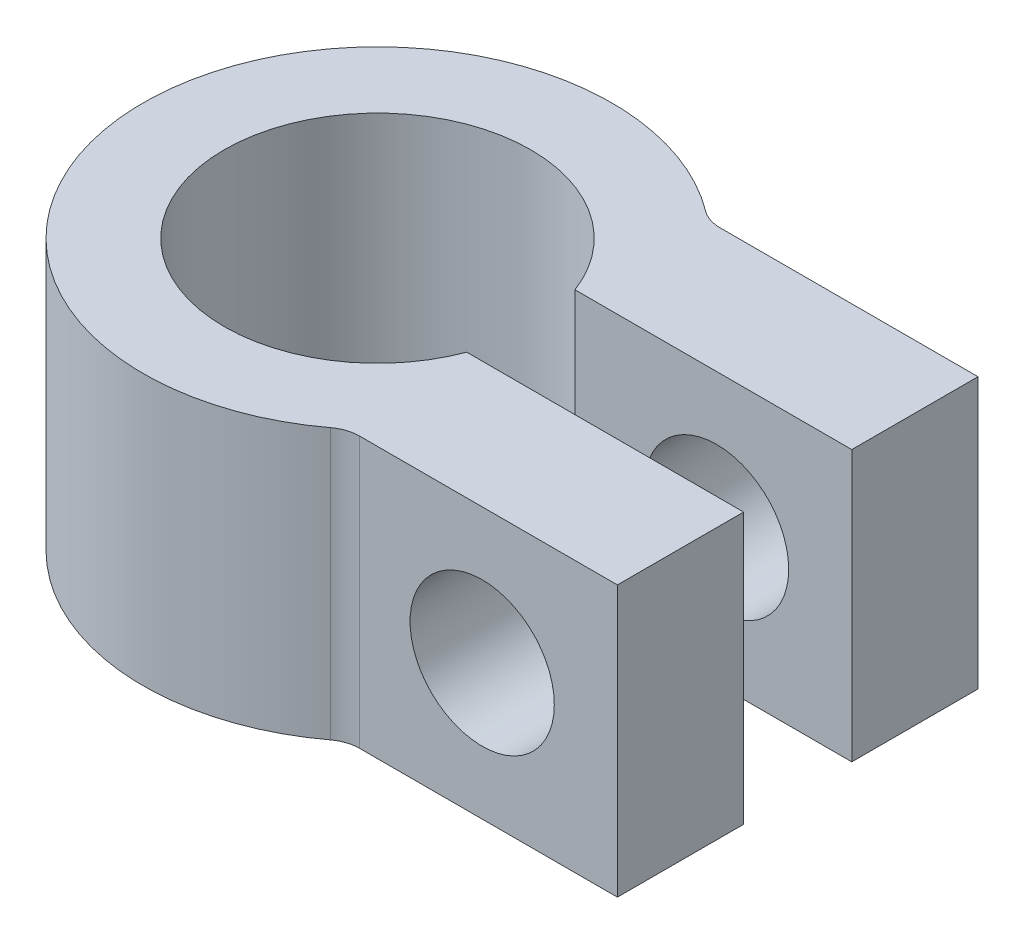
ISO-10303-21;
HEADER;
FILE_DESCRIPTION(('STEP AP214'),'2;1');
FILE_NAME('part.step','',(''),(''),'','','');
FILE_SCHEMA(('AUTOMOTIVE_DESIGN { 1 0 10303 214 1 1 1 1 }'));
ENDSEC;
DATA;
#1=APPLICATION_CONTEXT('core data for automotive mechanical design processes');
#2=APPLICATION_PROTOCOL_DEFINITION('international standard','automotive_design',2000,#1);
#3=PRODUCT_CONTEXT('',#1,'mechanical');
#4=PRODUCT('Part','Part','',(#3));
#5=PRODUCT_RELATED_PRODUCT_CATEGORY('part','',(#4));
#6=PRODUCT_DEFINITION_FORMATION('','',#4);
#7=PRODUCT_DEFINITION_CONTEXT('part definition',#1,'design');
#8=PRODUCT_DEFINITION('design','',#6,#7);
#9=PRODUCT_DEFINITION_SHAPE('','',#8);
#10=(LENGTH_UNIT() NAMED_UNIT(*) SI_UNIT(.MILLI.,.METRE.));
#11=(NAMED_UNIT(*) PLANE_ANGLE_UNIT() SI_UNIT($,.RADIAN.));
#12=(NAMED_UNIT(*) SI_UNIT($,.STERADIAN.) SOLID_ANGLE_UNIT());
#13=UNCERTAINTY_MEASURE_WITH_UNIT(LENGTH_MEASURE(1.E-05),#10,'distance_accuracy_value','');
#14=(GEOMETRIC_REPRESENTATION_CONTEXT(3) GLOBAL_UNCERTAINTY_ASSIGNED_CONTEXT((#13)) GLOBAL_UNIT_ASSIGNED_CONTEXT((#10,
#11,#12)) REPRESENTATION_CONTEXT('',''));
#15=CARTESIAN_POINT('',(0.,0.,0.));
#16=DIRECTION('',(0.,0.,1.));
#17=DIRECTION('',(1.,0.,0.));
#18=AXIS2_PLACEMENT_3D('',#15,#16,#17);
#19=CARTESIAN_POINT('',(0.,15.,0.));
#20=DIRECTION('',(0.,-1.,0.));
#21=DIRECTION('',(0.,0.,-1.));
#22=AXIS2_PLACEMENT_3D('',#19,#20,#21);
#23=CYLINDRICAL_SURFACE('',#22,13.);
#24=CARTESIAN_POINT('',(0.,15.,0.));
#25=DIRECTION('',(0.,1.,0.));
#26=DIRECTION('',(0.,0.,1.));
#27=AXIS2_PLACEMENT_3D('',#24,#25,#26);
#28=CIRCLE('',#27,13.);
#29=CARTESIAN_POINT('',(7.8,15.,-10.4));
#30=VERTEX_POINT('',#29);
#31=CARTESIAN_POINT('',(7.8,15.,10.4));
#32=VERTEX_POINT('',#31);
#33=EDGE_CURVE('E138',#30,#32,#28,.T.);
#34=ORIENTED_EDGE('',*,*,#33,.F.);
#35=DIRECTION('',(0.,-1.,0.));
#36=VECTOR('',#35,1.);
#37=CARTESIAN_POINT('',(7.8,15.,-10.4));
#38=LINE('',#37,#36);
#39=CARTESIAN_POINT('',(7.8,0.,-10.4));
#40=VERTEX_POINT('',#39);
#41=EDGE_CURVE('E163',#30,#40,#38,.T.);
#42=ORIENTED_EDGE('',*,*,#41,.T.);
#43=CARTESIAN_POINT('',(0.,0.,0.));
#44=DIRECTION('',(0.,1.,0.));
#45=DIRECTION('',(0.,0.,1.));
#46=AXIS2_PLACEMENT_3D('',#43,#44,#45);
#47=CIRCLE('',#46,13.);
#48=CARTESIAN_POINT('',(7.8,0.,10.4));
#49=VERTEX_POINT('',#48);
#50=EDGE_CURVE('E135',#40,#49,#47,.T.);
#51=ORIENTED_EDGE('',*,*,#50,.T.);
#52=DIRECTION('',(0.,-1.,0.));
#53=VECTOR('',#52,1.);
#54=CARTESIAN_POINT('',(7.8,15.,10.4));
#55=LINE('',#54,#53);
#56=EDGE_CURVE('E155',#49,#32,#55,.F.);
#57=ORIENTED_EDGE('',*,*,#56,.T.);
#58=EDGE_LOOP('',(#34,#42,#51,#57));
#59=FACE_BOUND('',#58,.T.);
#60=ADVANCED_FACE('F32',(#59),#23,.T.);
#61=CARTESIAN_POINT('',(0.,15.,0.));
#62=DIRECTION('',(0.,1.,0.));
#63=DIRECTION('',(0.,0.,1.));
#64=AXIS2_PLACEMENT_3D('',#61,#62,#63);
#65=PLANE('',#64);
#66=CARTESIAN_POINT('',(0.,15.,0.));
#67=DIRECTION('',(0.,1.,0.));
#68=DIRECTION('',(0.,0.,1.));
#69=AXIS2_PLACEMENT_3D('',#66,#67,#68);
#70=CIRCLE('',#69,8.5);
#71=CARTESIAN_POINT('',(7.95298686029343,15.,-3.));
#72=VERTEX_POINT('',#71);
#73=CARTESIAN_POINT('',(7.95298686029343,15.,3.));
#74=VERTEX_POINT('',#73);
#75=EDGE_CURVE('E113',#72,#74,#70,.T.);
#76=ORIENTED_EDGE('',*,*,#75,.F.);
#77=DIRECTION('',(1.,0.,0.));
#78=VECTOR('',#77,1.);
#79=CARTESIAN_POINT('',(23.3066238629181,15.,-3.));
#80=LINE('',#79,#78);
#81=CARTESIAN_POINT('',(23.3066238629181,15.,-3.));
#82=VERTEX_POINT('',#81);
#83=EDGE_CURVE('E197',#72,#82,#80,.T.);
#84=ORIENTED_EDGE('',*,*,#83,.T.);
#85=DIRECTION('',(0.,0.,-1.));
#86=VECTOR('',#85,1.);
#87=CARTESIAN_POINT('',(23.3066238629181,15.,-3.));
#88=LINE('',#87,#86);
#89=CARTESIAN_POINT('',(23.3066238629181,15.,-10.));
#90=VERTEX_POINT('',#89);
#91=EDGE_CURVE('E205',#82,#90,#88,.T.);
#92=ORIENTED_EDGE('',*,*,#91,.T.);
#93=DIRECTION('',(-1.,0.,0.));
#94=VECTOR('',#93,1.);
#95=CARTESIAN_POINT('',(8.30662386291808,15.,-10.));
#96=LINE('',#95,#94);
#97=CARTESIAN_POINT('',(9.,15.,-10.));
#98=VERTEX_POINT('',#97);
#99=EDGE_CURVE('E140',#90,#98,#96,.T.);
#100=ORIENTED_EDGE('',*,*,#99,.T.);
#101=CARTESIAN_POINT('',(9.,15.,-12.));
#102=DIRECTION('',(0.,1.,0.));
#103=DIRECTION('',(0.,0.,1.));
#104=AXIS2_PLACEMENT_3D('',#101,#102,#103);
#105=CIRCLE('',#104,2.);
#106=EDGE_CURVE('E11',#98,#30,#105,.F.);
#107=ORIENTED_EDGE('',*,*,#106,.T.);
#108=ORIENTED_EDGE('',*,*,#33,.T.);
#109=CARTESIAN_POINT('',(9.,15.,12.));
#110=DIRECTION('',(0.,1.,0.));
#111=DIRECTION('',(0.,0.,1.));
#112=AXIS2_PLACEMENT_3D('',#109,#110,#111);
#113=CIRCLE('',#112,2.);
#114=CARTESIAN_POINT('',(9.,15.,10.));
#115=VERTEX_POINT('',#114);
#116=EDGE_CURVE('E161',#32,#115,#113,.F.);
#117=ORIENTED_EDGE('',*,*,#116,.T.);
#118=DIRECTION('',(-1.,0.,0.));
#119=VECTOR('',#118,1.);
#120=CARTESIAN_POINT('',(8.30662386291808,15.,10.));
#121=LINE('',#120,#119);
#122=CARTESIAN_POINT('',(23.3066238629181,15.,10.));
#123=VERTEX_POINT('',#122);
#124=EDGE_CURVE('E119',#123,#115,#121,.T.);
#125=ORIENTED_EDGE('',*,*,#124,.F.);
#126=DIRECTION('',(0.,0.,1.));
#127=VECTOR('',#126,1.);
#128=CARTESIAN_POINT('',(23.3066238629181,15.,3.));
#129=LINE('',#128,#127);
#130=CARTESIAN_POINT('',(23.3066238629181,15.,3.));
#131=VERTEX_POINT('',#130);
#132=EDGE_CURVE('E115',#131,#123,#129,.T.);
#133=ORIENTED_EDGE('',*,*,#132,.F.);
#134=DIRECTION('',(1.,0.,0.));
#135=VECTOR('',#134,1.);
#136=CARTESIAN_POINT('',(23.3066238629181,15.,3.));
#137=LINE('',#136,#135);
#138=EDGE_CURVE('E108',#74,#131,#137,.T.);
#139=ORIENTED_EDGE('',*,*,#138,.F.);
#140=EDGE_LOOP('',(#76,#84,#92,#100,#107,#108,#117,#125,#133,#139));
#141=FACE_BOUND('',#140,.T.);
#142=ADVANCED_FACE('F110',(#141),#65,.T.);
#143=CARTESIAN_POINT('',(0.,0.,0.));
#144=DIRECTION('',(0.,1.,0.));
#145=DIRECTION('',(0.,0.,1.));
#146=AXIS2_PLACEMENT_3D('',#143,#144,#145);
#147=PLANE('',#146);
#148=DIRECTION('',(1.,0.,0.));
#149=VECTOR('',#148,1.);
#150=CARTESIAN_POINT('',(23.3066238629181,0.,-3.));
#151=LINE('',#150,#149);
#152=CARTESIAN_POINT('',(7.95298686029343,0.,-3.));
#153=VERTEX_POINT('',#152);
#154=CARTESIAN_POINT('',(23.3066238629181,0.,-3.));
#155=VERTEX_POINT('',#154);
#156=EDGE_CURVE('E194',#153,#155,#151,.T.);
#157=ORIENTED_EDGE('',*,*,#156,.F.);
#158=CARTESIAN_POINT('',(0.,0.,0.));
#159=DIRECTION('',(0.,1.,0.));
#160=DIRECTION('',(0.,0.,1.));
#161=AXIS2_PLACEMENT_3D('',#158,#159,#160);
#162=CIRCLE('',#161,8.5);
#163=CARTESIAN_POINT('',(7.95298686029343,0.,3.));
#164=VERTEX_POINT('',#163);
#165=EDGE_CURVE('E136',#153,#164,#162,.T.);
#166=ORIENTED_EDGE('',*,*,#165,.T.);
#167=DIRECTION('',(1.,0.,0.));
#168=VECTOR('',#167,1.);
#169=CARTESIAN_POINT('',(23.3066238629181,0.,3.));
#170=LINE('',#169,#168);
#171=CARTESIAN_POINT('',(23.3066238629181,0.,3.));
#172=VERTEX_POINT('',#171);
#173=EDGE_CURVE('E125',#164,#172,#170,.T.);
#174=ORIENTED_EDGE('',*,*,#173,.T.);
#175=DIRECTION('',(0.,0.,1.));
#176=VECTOR('',#175,1.);
#177=CARTESIAN_POINT('',(23.3066238629181,0.,3.));
#178=LINE('',#177,#176);
#179=CARTESIAN_POINT('',(23.3066238629181,0.,10.));
#180=VERTEX_POINT('',#179);
#181=EDGE_CURVE('E190',#172,#180,#178,.T.);
#182=ORIENTED_EDGE('',*,*,#181,.T.);
#183=DIRECTION('',(-1.,0.,0.));
#184=VECTOR('',#183,1.);
#185=CARTESIAN_POINT('',(8.30662386291808,0.,10.));
#186=LINE('',#185,#184);
#187=CARTESIAN_POINT('',(9.,0.,10.));
#188=VERTEX_POINT('',#187);
#189=EDGE_CURVE('E176',#180,#188,#186,.T.);
#190=ORIENTED_EDGE('',*,*,#189,.T.);
#191=CARTESIAN_POINT('',(9.,0.,12.));
#192=DIRECTION('',(0.,1.,0.));
#193=DIRECTION('',(0.,0.,1.));
#194=AXIS2_PLACEMENT_3D('',#191,#192,#193);
#195=CIRCLE('',#194,2.);
#196=EDGE_CURVE('E158',#188,#49,#195,.T.);
#197=ORIENTED_EDGE('',*,*,#196,.T.);
#198=ORIENTED_EDGE('',*,*,#50,.F.);
#199=CARTESIAN_POINT('',(9.,0.,-12.));
#200=DIRECTION('',(0.,1.,0.));
#201=DIRECTION('',(0.,0.,1.));
#202=AXIS2_PLACEMENT_3D('',#199,#200,#201);
#203=CIRCLE('',#202,2.);
#204=CARTESIAN_POINT('',(9.,0.,-10.));
#205=VERTEX_POINT('',#204);
#206=EDGE_CURVE('E40',#40,#205,#203,.T.);
#207=ORIENTED_EDGE('',*,*,#206,.T.);
#208=DIRECTION('',(-1.,0.,0.));
#209=VECTOR('',#208,1.);
#210=CARTESIAN_POINT('',(8.30662386291808,0.,-10.));
#211=LINE('',#210,#209);
#212=CARTESIAN_POINT('',(23.3066238629181,0.,-10.));
#213=VERTEX_POINT('',#212);
#214=EDGE_CURVE('E198',#213,#205,#211,.T.);
#215=ORIENTED_EDGE('',*,*,#214,.F.);
#216=DIRECTION('',(0.,0.,-1.));
#217=VECTOR('',#216,1.);
#218=CARTESIAN_POINT('',(23.3066238629181,0.,-3.));
#219=LINE('',#218,#217);
#220=EDGE_CURVE('E201',#155,#213,#219,.T.);
#221=ORIENTED_EDGE('',*,*,#220,.F.);
#222=EDGE_LOOP('',(#157,#166,#174,#182,#190,#197,#198,#207,#215,#221));
#223=FACE_BOUND('',#222,.T.);
#224=ADVANCED_FACE('F171',(#223),#147,.F.);
#225=CARTESIAN_POINT('',(0.,15.,0.));
#226=DIRECTION('',(0.,-1.,0.));
#227=DIRECTION('',(0.,0.,-1.));
#228=AXIS2_PLACEMENT_3D('',#225,#226,#227);
#229=CYLINDRICAL_SURFACE('',#228,8.5);
#230=DIRECTION('',(0.,-1.,0.));
#231=VECTOR('',#230,1.);
#232=CARTESIAN_POINT('',(7.95298686029343,15.,-3.));
#233=LINE('',#232,#231);
#234=EDGE_CURVE('E129',#72,#153,#233,.T.);
#235=ORIENTED_EDGE('',*,*,#234,.F.);
#236=ORIENTED_EDGE('',*,*,#75,.T.);
#237=DIRECTION('',(0.,-1.,0.));
#238=VECTOR('',#237,1.);
#239=CARTESIAN_POINT('',(7.95298686029343,15.,3.));
#240=LINE('',#239,#238);
#241=EDGE_CURVE('E122',#164,#74,#240,.F.);
#242=ORIENTED_EDGE('',*,*,#241,.F.);
#243=ORIENTED_EDGE('',*,*,#165,.F.);
#244=EDGE_LOOP('',(#235,#236,#242,#243));
#245=FACE_BOUND('',#244,.T.);
#246=ADVANCED_FACE('F133',(#245),#229,.F.);
#247=CARTESIAN_POINT('',(23.3066238629181,31.5529453572468,-3.));
#248=DIRECTION('',(-1.,0.,0.));
#249=DIRECTION('',(0.,0.,1.));
#250=AXIS2_PLACEMENT_3D('',#247,#248,#249);
#251=PLANE('',#250);
#252=ORIENTED_EDGE('',*,*,#91,.F.);
#253=DIRECTION('',(0.,-1.,0.));
#254=VECTOR('',#253,1.);
#255=CARTESIAN_POINT('',(23.3066238629181,31.5529453572468,-3.));
#256=LINE('',#255,#254);
#257=EDGE_CURVE('E143',#82,#155,#256,.T.);
#258=ORIENTED_EDGE('',*,*,#257,.T.);
#259=ORIENTED_EDGE('',*,*,#220,.T.);
#260=DIRECTION('',(0.,-1.,0.));
#261=VECTOR('',#260,1.);
#262=CARTESIAN_POINT('',(23.3066238629181,31.5529453572468,-10.));
#263=LINE('',#262,#261);
#264=EDGE_CURVE('E200',#90,#213,#263,.T.);
#265=ORIENTED_EDGE('',*,*,#264,.F.);
#266=EDGE_LOOP('',(#252,#258,#259,#265));
#267=FACE_BOUND('',#266,.T.);
#268=ADVANCED_FACE('F213',(#267),#251,.F.);
#269=CARTESIAN_POINT('',(8.30662386291808,31.5529453572468,-10.));
#270=DIRECTION('',(0.,0.,1.));
#271=DIRECTION('',(1.,0.,0.));
#272=AXIS2_PLACEMENT_3D('',#269,#270,#271);
#273=PLANE('',#272);
#274=CARTESIAN_POINT('',(15.8066238629181,7.5,-10.));
#275=DIRECTION('',(0.,0.,1.));
#276=DIRECTION('',(1.,0.,0.));
#277=AXIS2_PLACEMENT_3D('',#274,#275,#276);
#278=CIRCLE('',#277,4.);
#279=CARTESIAN_POINT('',(19.8066238629181,7.5,-10.));
#280=VERTEX_POINT('',#279);
#281=EDGE_CURVE('E130',#280,#280,#278,.T.);
#282=ORIENTED_EDGE('',*,*,#281,.T.);
#283=EDGE_LOOP('',(#282));
#284=FACE_BOUND('',#283,.T.);
#285=ORIENTED_EDGE('',*,*,#214,.T.);
#286=DIRECTION('',(0.,1.,0.));
#287=VECTOR('',#286,1.);
#288=CARTESIAN_POINT('',(9.,15.,-10.));
#289=LINE('',#288,#287);
#290=EDGE_CURVE('E53',#205,#98,#289,.T.);
#291=ORIENTED_EDGE('',*,*,#290,.T.);
#292=ORIENTED_EDGE('',*,*,#99,.F.);
#293=ORIENTED_EDGE('',*,*,#264,.T.);
#294=EDGE_LOOP('',(#285,#291,#292,#293));
#295=FACE_BOUND('',#294,.T.);
#296=ADVANCED_FACE('F209',(#284,#295),#273,.F.);
#297=CARTESIAN_POINT('',(23.3066238629181,31.5529453572468,-3.));
#298=DIRECTION('',(0.,0.,-1.));
#299=DIRECTION('',(-1.,0.,0.));
#300=AXIS2_PLACEMENT_3D('',#297,#298,#299);
#301=PLANE('',#300);
#302=CARTESIAN_POINT('',(15.8066238629181,7.5,-3.));
#303=DIRECTION('',(0.,0.,-1.));
#304=DIRECTION('',(-1.,0.,0.));
#305=AXIS2_PLACEMENT_3D('',#302,#303,#304);
#306=CIRCLE('',#305,4.);
#307=CARTESIAN_POINT('',(11.8066238629181,7.5,-3.));
#308=VERTEX_POINT('',#307);
#309=EDGE_CURVE('E151',#308,#308,#306,.T.);
#310=ORIENTED_EDGE('',*,*,#309,.T.);
#311=EDGE_LOOP('',(#310));
#312=FACE_BOUND('',#311,.T.);
#313=ORIENTED_EDGE('',*,*,#83,.F.);
#314=ORIENTED_EDGE('',*,*,#234,.T.);
#315=ORIENTED_EDGE('',*,*,#156,.T.);
#316=ORIENTED_EDGE('',*,*,#257,.F.);
#317=EDGE_LOOP('',(#313,#314,#315,#316));
#318=FACE_BOUND('',#317,.T.);
#319=ADVANCED_FACE('F215',(#312,#318),#301,.F.);
#320=CARTESIAN_POINT('',(8.30662386291808,31.5529453572468,10.));
#321=DIRECTION('',(0.,0.,1.));
#322=DIRECTION('',(1.,0.,0.));
#323=AXIS2_PLACEMENT_3D('',#320,#321,#322);
#324=PLANE('',#323);
#325=CARTESIAN_POINT('',(15.8066238629181,7.5,10.));
#326=DIRECTION('',(0.,0.,1.));
#327=DIRECTION('',(1.,0.,0.));
#328=AXIS2_PLACEMENT_3D('',#325,#326,#327);
#329=CIRCLE('',#328,4.);
#330=CARTESIAN_POINT('',(19.8066238629181,7.5,10.));
#331=VERTEX_POINT('',#330);
#332=EDGE_CURVE('E152',#331,#331,#329,.T.);
#333=ORIENTED_EDGE('',*,*,#332,.F.);
#334=EDGE_LOOP('',(#333));
#335=FACE_BOUND('',#334,.T.);
#336=ORIENTED_EDGE('',*,*,#124,.T.);
#337=DIRECTION('',(0.,-1.,0.));
#338=VECTOR('',#337,1.);
#339=CARTESIAN_POINT('',(9.,31.5529453572468,10.));
#340=LINE('',#339,#338);
#341=EDGE_CURVE('E146',#115,#188,#340,.T.);
#342=ORIENTED_EDGE('',*,*,#341,.T.);
#343=ORIENTED_EDGE('',*,*,#189,.F.);
#344=DIRECTION('',(0.,-1.,0.));
#345=VECTOR('',#344,1.);
#346=CARTESIAN_POINT('',(23.3066238629181,31.5529453572468,10.));
#347=LINE('',#346,#345);
#348=EDGE_CURVE('E185',#123,#180,#347,.T.);
#349=ORIENTED_EDGE('',*,*,#348,.F.);
#350=EDGE_LOOP('',(#336,#342,#343,#349));
#351=FACE_BOUND('',#350,.T.);
#352=ADVANCED_FACE('F184',(#335,#351),#324,.T.);
#353=CARTESIAN_POINT('',(23.3066238629181,31.5529453572468,3.));
#354=DIRECTION('',(0.,0.,-1.));
#355=DIRECTION('',(-1.,0.,0.));
#356=AXIS2_PLACEMENT_3D('',#353,#354,#355);
#357=PLANE('',#356);
#358=CARTESIAN_POINT('',(15.8066238629181,7.5,3.));
#359=DIRECTION('',(0.,0.,-1.));
#360=DIRECTION('',(-1.,0.,0.));
#361=AXIS2_PLACEMENT_3D('',#358,#359,#360);
#362=CIRCLE('',#361,4.);
#363=CARTESIAN_POINT('',(11.8066238629181,7.5,3.));
#364=VERTEX_POINT('',#363);
#365=EDGE_CURVE('E148',#364,#364,#362,.T.);
#366=ORIENTED_EDGE('',*,*,#365,.F.);
#367=EDGE_LOOP('',(#366));
#368=FACE_BOUND('',#367,.T.);
#369=ORIENTED_EDGE('',*,*,#173,.F.);
#370=ORIENTED_EDGE('',*,*,#241,.T.);
#371=ORIENTED_EDGE('',*,*,#138,.T.);
#372=DIRECTION('',(0.,-1.,0.));
#373=VECTOR('',#372,1.);
#374=CARTESIAN_POINT('',(23.3066238629181,31.5529453572468,3.));
#375=LINE('',#374,#373);
#376=EDGE_CURVE('E118',#131,#172,#375,.T.);
#377=ORIENTED_EDGE('',*,*,#376,.T.);
#378=EDGE_LOOP('',(#369,#370,#371,#377));
#379=FACE_BOUND('',#378,.T.);
#380=ADVANCED_FACE('F123',(#368,#379),#357,.T.);
#381=CARTESIAN_POINT('',(23.3066238629181,31.5529453572468,3.));
#382=DIRECTION('',(1.,0.,0.));
#383=DIRECTION('',(0.,0.,-1.));
#384=AXIS2_PLACEMENT_3D('',#381,#382,#383);
#385=PLANE('',#384);
#386=ORIENTED_EDGE('',*,*,#376,.F.);
#387=ORIENTED_EDGE('',*,*,#132,.T.);
#388=ORIENTED_EDGE('',*,*,#348,.T.);
#389=ORIENTED_EDGE('',*,*,#181,.F.);
#390=EDGE_LOOP('',(#386,#387,#388,#389));
#391=FACE_BOUND('',#390,.T.);
#392=ADVANCED_FACE('F236',(#391),#385,.T.);
#393=CARTESIAN_POINT('',(15.8066238629181,7.5,-13.));
#394=DIRECTION('',(0.,0.,1.));
#395=DIRECTION('',(1.,0.,0.));
#396=AXIS2_PLACEMENT_3D('',#393,#394,#395);
#397=CYLINDRICAL_SURFACE('',#396,4.);
#398=ORIENTED_EDGE('',*,*,#365,.T.);
#399=EDGE_LOOP('',(#398));
#400=FACE_BOUND('',#399,.T.);
#401=ORIENTED_EDGE('',*,*,#332,.T.);
#402=EDGE_LOOP('',(#401));
#403=FACE_BOUND('',#402,.T.);
#404=ADVANCED_FACE('F228',(#400,#403),#397,.F.);
#405=ORIENTED_EDGE('',*,*,#309,.F.);
#406=EDGE_LOOP('',(#405));
#407=FACE_BOUND('',#406,.T.);
#408=ORIENTED_EDGE('',*,*,#281,.F.);
#409=EDGE_LOOP('',(#408));
#410=FACE_BOUND('',#409,.T.);
#411=ADVANCED_FACE('F249',(#407,#410),#397,.F.);
#412=CARTESIAN_POINT('',(9.,15.,12.));
#413=DIRECTION('',(0.,-1.,0.));
#414=DIRECTION('',(0.,0.,-1.));
#415=AXIS2_PLACEMENT_3D('',#412,#413,#414);
#416=CYLINDRICAL_SURFACE('',#415,2.);
#417=ORIENTED_EDGE('',*,*,#116,.F.);
#418=ORIENTED_EDGE('',*,*,#56,.F.);
#419=ORIENTED_EDGE('',*,*,#196,.F.);
#420=ORIENTED_EDGE('',*,*,#341,.F.);
#421=EDGE_LOOP('',(#417,#418,#419,#420));
#422=FACE_BOUND('',#421,.T.);
#423=ADVANCED_FACE('F180',(#422),#416,.F.);
#424=CARTESIAN_POINT('',(9.,15.,-12.));
#425=DIRECTION('',(0.,-1.,0.));
#426=DIRECTION('',(0.,0.,-1.));
#427=AXIS2_PLACEMENT_3D('',#424,#425,#426);
#428=CYLINDRICAL_SURFACE('',#427,2.);
#429=ORIENTED_EDGE('',*,*,#106,.F.);
#430=ORIENTED_EDGE('',*,*,#290,.F.);
#431=ORIENTED_EDGE('',*,*,#206,.F.);
#432=ORIENTED_EDGE('',*,*,#41,.F.);
#433=EDGE_LOOP('',(#429,#430,#431,#432));
#434=FACE_BOUND('',#433,.T.);
#435=ADVANCED_FACE('F34',(#434),#428,.F.);
#436=CLOSED_SHELL('',(#60,#142,#224,#246,#268,#296,#319,#352,#380,#392,#404,#411,#423,#435));
#437=MANIFOLD_SOLID_BREP('B2',#436);
#438=ADVANCED_BREP_SHAPE_REPRESENTATION('',(#18,#437),#14);
#439=SHAPE_DEFINITION_REPRESENTATION(#9,#438);
ENDSEC;
END-ISO-10303-21;
